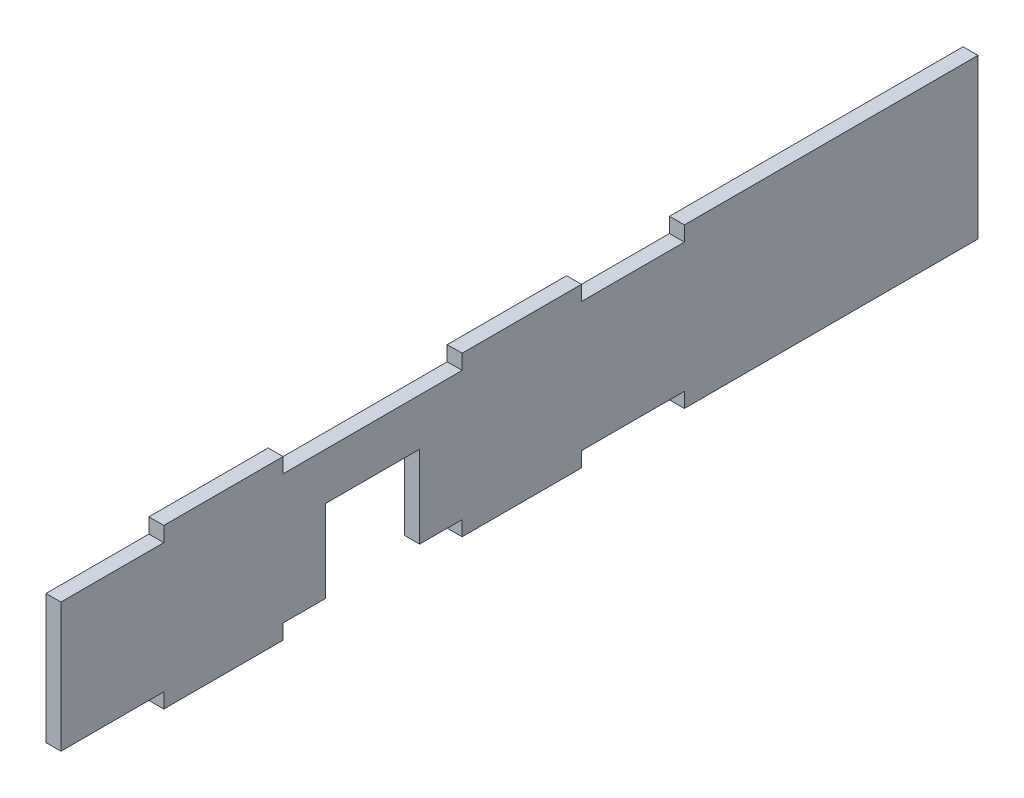
ISO-10303-21;
HEADER;
FILE_DESCRIPTION(('STEP AP214'),'2;1');
FILE_NAME('part.step','',(''),(''),'','','');
FILE_SCHEMA(('AUTOMOTIVE_DESIGN { 1 0 10303 214 1 1 1 1 }'));
ENDSEC;
DATA;
#1=APPLICATION_CONTEXT('core data for automotive mechanical design processes');
#2=APPLICATION_PROTOCOL_DEFINITION('international standard','automotive_design',2000,#1);
#3=PRODUCT_CONTEXT('',#1,'mechanical');
#4=PRODUCT('Part','Part','',(#3));
#5=PRODUCT_RELATED_PRODUCT_CATEGORY('part','',(#4));
#6=PRODUCT_DEFINITION_FORMATION('','',#4);
#7=PRODUCT_DEFINITION_CONTEXT('part definition',#1,'design');
#8=PRODUCT_DEFINITION('design','',#6,#7);
#9=PRODUCT_DEFINITION_SHAPE('','',#8);
#10=(LENGTH_UNIT() NAMED_UNIT(*) SI_UNIT(.MILLI.,.METRE.));
#11=(NAMED_UNIT(*) PLANE_ANGLE_UNIT() SI_UNIT($,.RADIAN.));
#12=(NAMED_UNIT(*) SI_UNIT($,.STERADIAN.) SOLID_ANGLE_UNIT());
#13=UNCERTAINTY_MEASURE_WITH_UNIT(LENGTH_MEASURE(1.E-05),#10,'distance_accuracy_value','');
#14=(GEOMETRIC_REPRESENTATION_CONTEXT(3) GLOBAL_UNCERTAINTY_ASSIGNED_CONTEXT((#13)) GLOBAL_UNIT_ASSIGNED_CONTEXT((#10,
#11,#12)) REPRESENTATION_CONTEXT('',''));
#15=CARTESIAN_POINT('',(0.,0.,0.));
#16=DIRECTION('',(0.,0.,1.));
#17=DIRECTION('',(1.,0.,0.));
#18=AXIS2_PLACEMENT_3D('',#15,#16,#17);
#19=CARTESIAN_POINT('',(6.35,0.,-20.));
#20=DIRECTION('',(0.,0.,1.));
#21=DIRECTION('',(1.,0.,0.));
#22=AXIS2_PLACEMENT_3D('',#19,#20,#21);
#23=PLANE('',#22);
#24=DIRECTION('',(0.,1.,0.));
#25=VECTOR('',#24,1.);
#26=CARTESIAN_POINT('',(0.,0.,-20.));
#27=LINE('',#26,#25);
#28=CARTESIAN_POINT('',(0.,0.,-20.));
#29=VERTEX_POINT('',#28);
#30=CARTESIAN_POINT('',(0.,35.,-20.));
#31=VERTEX_POINT('',#30);
#32=EDGE_CURVE('E467',#29,#31,#27,.T.);
#33=ORIENTED_EDGE('',*,*,#32,.F.);
#34=DIRECTION('',(1.,0.,0.));
#35=VECTOR('',#34,1.);
#36=CARTESIAN_POINT('',(0.,0.,-20.));
#37=LINE('',#36,#35);
#38=CARTESIAN_POINT('',(6.35,0.,-20.));
#39=VERTEX_POINT('',#38);
#40=EDGE_CURVE('E230',#29,#39,#37,.T.);
#41=ORIENTED_EDGE('',*,*,#40,.T.);
#42=DIRECTION('',(0.,1.,0.));
#43=VECTOR('',#42,1.);
#44=CARTESIAN_POINT('',(6.35,0.,-20.));
#45=LINE('',#44,#43);
#46=CARTESIAN_POINT('',(6.35,35.,-20.));
#47=VERTEX_POINT('',#46);
#48=EDGE_CURVE('E468',#39,#47,#45,.T.);
#49=ORIENTED_EDGE('',*,*,#48,.T.);
#50=DIRECTION('',(-1.,0.,0.));
#51=VECTOR('',#50,1.);
#52=CARTESIAN_POINT('',(6.35,35.,-20.));
#53=LINE('',#52,#51);
#54=EDGE_CURVE('E48',#47,#31,#53,.T.);
#55=ORIENTED_EDGE('',*,*,#54,.T.);
#56=EDGE_LOOP('',(#33,#41,#49,#55));
#57=FACE_BOUND('',#56,.T.);
#58=ADVANCED_FACE('F40',(#57),#23,.T.);
#59=CARTESIAN_POINT('',(6.35,0.,132.7));
#60=DIRECTION('',(0.,0.,1.));
#61=DIRECTION('',(1.,0.,0.));
#62=AXIS2_PLACEMENT_3D('',#59,#60,#61);
#63=PLANE('',#62);
#64=DIRECTION('',(0.,1.,0.));
#65=VECTOR('',#64,1.);
#66=CARTESIAN_POINT('',(0.,0.,132.7));
#67=LINE('',#66,#65);
#68=CARTESIAN_POINT('',(0.,0.,132.7));
#69=VERTEX_POINT('',#68);
#70=CARTESIAN_POINT('',(0.,55.000000012,132.7));
#71=VERTEX_POINT('',#70);
#72=EDGE_CURVE('E492',#69,#71,#67,.T.);
#73=ORIENTED_EDGE('',*,*,#72,.F.);
#74=DIRECTION('',(1.,0.,0.));
#75=VECTOR('',#74,1.);
#76=CARTESIAN_POINT('',(0.,0.,132.7));
#77=LINE('',#76,#75);
#78=CARTESIAN_POINT('',(6.35,0.,132.7));
#79=VERTEX_POINT('',#78);
#80=EDGE_CURVE('E306',#69,#79,#77,.T.);
#81=ORIENTED_EDGE('',*,*,#80,.T.);
#82=DIRECTION('',(0.,1.,0.));
#83=VECTOR('',#82,1.);
#84=CARTESIAN_POINT('',(6.35,0.,132.7));
#85=LINE('',#84,#83);
#86=CARTESIAN_POINT('',(6.35,55.000000012,132.7));
#87=VERTEX_POINT('',#86);
#88=EDGE_CURVE('E476',#79,#87,#85,.T.);
#89=ORIENTED_EDGE('',*,*,#88,.T.);
#90=DIRECTION('',(1.,0.,0.));
#91=VECTOR('',#90,1.);
#92=CARTESIAN_POINT('',(0.,55.000000012,132.7));
#93=LINE('',#92,#91);
#94=EDGE_CURVE('E423',#71,#87,#93,.T.);
#95=ORIENTED_EDGE('',*,*,#94,.F.);
#96=EDGE_LOOP('',(#73,#81,#89,#95));
#97=FACE_BOUND('',#96,.T.);
#98=ADVANCED_FACE('F542',(#97),#63,.T.);
#99=CARTESIAN_POINT('',(6.35,0.,20.));
#100=DIRECTION('',(0.,0.,1.));
#101=DIRECTION('',(1.,0.,0.));
#102=AXIS2_PLACEMENT_3D('',#99,#100,#101);
#103=PLANE('',#102);
#104=DIRECTION('',(1.,0.,0.));
#105=VECTOR('',#104,1.);
#106=CARTESIAN_POINT('',(0.,0.,20.));
#107=LINE('',#106,#105);
#108=CARTESIAN_POINT('',(0.,0.,20.));
#109=VERTEX_POINT('',#108);
#110=CARTESIAN_POINT('',(6.35,0.,20.));
#111=VERTEX_POINT('',#110);
#112=EDGE_CURVE('E254',#109,#111,#107,.T.);
#113=ORIENTED_EDGE('',*,*,#112,.F.);
#114=DIRECTION('',(0.,1.,0.));
#115=VECTOR('',#114,1.);
#116=CARTESIAN_POINT('',(0.,0.,20.));
#117=LINE('',#116,#115);
#118=CARTESIAN_POINT('',(0.,35.,20.));
#119=VERTEX_POINT('',#118);
#120=EDGE_CURVE('E496',#109,#119,#117,.T.);
#121=ORIENTED_EDGE('',*,*,#120,.T.);
#122=DIRECTION('',(-1.,0.,0.));
#123=VECTOR('',#122,1.);
#124=CARTESIAN_POINT('',(6.35,35.,20.));
#125=LINE('',#124,#123);
#126=CARTESIAN_POINT('',(6.35,35.,20.));
#127=VERTEX_POINT('',#126);
#128=EDGE_CURVE('E11',#127,#119,#125,.T.);
#129=ORIENTED_EDGE('',*,*,#128,.F.);
#130=DIRECTION('',(0.,1.,0.));
#131=VECTOR('',#130,1.);
#132=CARTESIAN_POINT('',(6.35,0.,20.));
#133=LINE('',#132,#131);
#134=EDGE_CURVE('E480',#111,#127,#133,.T.);
#135=ORIENTED_EDGE('',*,*,#134,.F.);
#136=EDGE_LOOP('',(#113,#121,#129,#135));
#137=FACE_BOUND('',#136,.T.);
#138=ADVANCED_FACE('F515',(#137),#103,.F.);
#139=CARTESIAN_POINT('',(6.35,0.,0.));
#140=DIRECTION('',(1.,0.,0.));
#141=DIRECTION('',(0.,0.,-1.));
#142=AXIS2_PLACEMENT_3D('',#139,#140,#141);
#143=PLANE('',#142);
#144=DIRECTION('',(0.,0.,-1.));
#145=VECTOR('',#144,1.);
#146=CARTESIAN_POINT('',(6.35,0.,0.));
#147=LINE('',#146,#145);
#148=CARTESIAN_POINT('',(6.35,0.,-88.9));
#149=VERTEX_POINT('',#148);
#150=CARTESIAN_POINT('',(6.35,0.,-132.7));
#151=VERTEX_POINT('',#150);
#152=EDGE_CURVE('E389',#149,#151,#147,.T.);
#153=ORIENTED_EDGE('',*,*,#152,.T.);
#154=DIRECTION('',(0.,-1.,0.));
#155=VECTOR('',#154,1.);
#156=CARTESIAN_POINT('',(6.35,0.,-132.7));
#157=LINE('',#156,#155);
#158=CARTESIAN_POINT('',(6.35,-6.35,-132.7));
#159=VERTEX_POINT('',#158);
#160=EDGE_CURVE('E382',#151,#159,#157,.T.);
#161=ORIENTED_EDGE('',*,*,#160,.T.);
#162=DIRECTION('',(0.,0.,1.));
#163=VECTOR('',#162,1.);
#164=CARTESIAN_POINT('',(6.35,-6.35,-257.700000096));
#165=LINE('',#164,#163);
#166=CARTESIAN_POINT('',(6.35,-6.35,-257.700000096));
#167=VERTEX_POINT('',#166);
#168=EDGE_CURVE('E463',#167,#159,#165,.T.);
#169=ORIENTED_EDGE('',*,*,#168,.F.);
#170=DIRECTION('',(0.,1.,0.));
#171=VECTOR('',#170,1.);
#172=CARTESIAN_POINT('',(6.35,0.,-257.700000096));
#173=LINE('',#172,#171);
#174=CARTESIAN_POINT('',(6.35,61.350000012,-257.700000096));
#175=VERTEX_POINT('',#174);
#176=EDGE_CURVE('E471',#167,#175,#173,.T.);
#177=ORIENTED_EDGE('',*,*,#176,.T.);
#178=DIRECTION('',(0.,0.,-1.));
#179=VECTOR('',#178,1.);
#180=CARTESIAN_POINT('',(6.35,61.350000012,132.7));
#181=LINE('',#180,#179);
#182=CARTESIAN_POINT('',(6.35,61.350000012,-132.7));
#183=VERTEX_POINT('',#182);
#184=EDGE_CURVE('E441',#183,#175,#181,.T.);
#185=ORIENTED_EDGE('',*,*,#184,.F.);
#186=DIRECTION('',(0.,1.,0.));
#187=VECTOR('',#186,1.);
#188=CARTESIAN_POINT('',(6.35,0.,-132.7));
#189=LINE('',#188,#187);
#190=CARTESIAN_POINT('',(6.35,55.000000012,-132.7));
#191=VERTEX_POINT('',#190);
#192=EDGE_CURVE('E348',#191,#183,#189,.T.);
#193=ORIENTED_EDGE('',*,*,#192,.F.);
#194=DIRECTION('',(0.,0.,1.));
#195=VECTOR('',#194,1.);
#196=CARTESIAN_POINT('',(6.35,55.000000012,0.));
#197=LINE('',#196,#195);
#198=CARTESIAN_POINT('',(6.35,55.000000012,-88.9));
#199=VERTEX_POINT('',#198);
#200=EDGE_CURVE('E360',#191,#199,#197,.T.);
#201=ORIENTED_EDGE('',*,*,#200,.T.);
#202=DIRECTION('',(0.,1.,0.));
#203=VECTOR('',#202,1.);
#204=CARTESIAN_POINT('',(6.35,0.,-88.9));
#205=LINE('',#204,#203);
#206=CARTESIAN_POINT('',(6.35,61.350000012,-88.9));
#207=VERTEX_POINT('',#206);
#208=EDGE_CURVE('E356',#199,#207,#205,.T.);
#209=ORIENTED_EDGE('',*,*,#208,.T.);
#210=CARTESIAN_POINT('',(6.35,61.350000012,-38.1));
#211=VERTEX_POINT('',#210);
#212=EDGE_CURVE('E445',#211,#207,#181,.T.);
#213=ORIENTED_EDGE('',*,*,#212,.F.);
#214=DIRECTION('',(0.,1.,0.));
#215=VECTOR('',#214,1.);
#216=CARTESIAN_POINT('',(6.35,0.,-38.1));
#217=LINE('',#216,#215);
#218=CARTESIAN_POINT('',(6.35,55.000000012,-38.1));
#219=VERTEX_POINT('',#218);
#220=EDGE_CURVE('E316',#219,#211,#217,.T.);
#221=ORIENTED_EDGE('',*,*,#220,.F.);
#222=DIRECTION('',(0.,0.,1.));
#223=VECTOR('',#222,1.);
#224=CARTESIAN_POINT('',(6.35,55.000000012,0.));
#225=LINE('',#224,#223);
#226=CARTESIAN_POINT('',(6.35,55.000000012,38.1));
#227=VERTEX_POINT('',#226);
#228=EDGE_CURVE('E327',#219,#227,#225,.T.);
#229=ORIENTED_EDGE('',*,*,#228,.T.);
#230=DIRECTION('',(0.,1.,0.));
#231=VECTOR('',#230,1.);
#232=CARTESIAN_POINT('',(6.35,0.,38.1));
#233=LINE('',#232,#231);
#234=CARTESIAN_POINT('',(6.35,61.350000012,38.1));
#235=VERTEX_POINT('',#234);
#236=EDGE_CURVE('E259',#227,#235,#233,.T.);
#237=ORIENTED_EDGE('',*,*,#236,.T.);
#238=CARTESIAN_POINT('',(6.35,61.350000012,88.9));
#239=VERTEX_POINT('',#238);
#240=EDGE_CURVE('E446',#239,#235,#181,.T.);
#241=ORIENTED_EDGE('',*,*,#240,.F.);
#242=DIRECTION('',(0.,1.,0.));
#243=VECTOR('',#242,1.);
#244=CARTESIAN_POINT('',(6.35,0.,88.9));
#245=LINE('',#244,#243);
#246=CARTESIAN_POINT('',(6.35,55.000000012,88.9));
#247=VERTEX_POINT('',#246);
#248=EDGE_CURVE('E413',#247,#239,#245,.T.);
#249=ORIENTED_EDGE('',*,*,#248,.F.);
#250=DIRECTION('',(0.,0.,1.));
#251=VECTOR('',#250,1.);
#252=CARTESIAN_POINT('',(6.35,55.000000012,0.));
#253=LINE('',#252,#251);
#254=EDGE_CURVE('E305',#247,#87,#253,.T.);
#255=ORIENTED_EDGE('',*,*,#254,.T.);
#256=ORIENTED_EDGE('',*,*,#88,.F.);
#257=DIRECTION('',(0.,0.,-1.));
#258=VECTOR('',#257,1.);
#259=CARTESIAN_POINT('',(6.35,0.,0.));
#260=LINE('',#259,#258);
#261=CARTESIAN_POINT('',(6.35,0.,88.9));
#262=VERTEX_POINT('',#261);
#263=EDGE_CURVE('E290',#79,#262,#260,.T.);
#264=ORIENTED_EDGE('',*,*,#263,.T.);
#265=DIRECTION('',(0.,-1.,0.));
#266=VECTOR('',#265,1.);
#267=CARTESIAN_POINT('',(6.35,0.,88.9));
#268=LINE('',#267,#266);
#269=CARTESIAN_POINT('',(6.35,-6.35,88.9));
#270=VERTEX_POINT('',#269);
#271=EDGE_CURVE('E294',#262,#270,#268,.T.);
#272=ORIENTED_EDGE('',*,*,#271,.T.);
#273=DIRECTION('',(0.,0.,1.));
#274=VECTOR('',#273,1.);
#275=CARTESIAN_POINT('',(6.35,-6.35,20.));
#276=LINE('',#275,#274);
#277=CARTESIAN_POINT('',(6.35,-6.35,38.1));
#278=VERTEX_POINT('',#277);
#279=EDGE_CURVE('E451',#278,#270,#276,.T.);
#280=ORIENTED_EDGE('',*,*,#279,.F.);
#281=DIRECTION('',(0.,-1.,0.));
#282=VECTOR('',#281,1.);
#283=CARTESIAN_POINT('',(6.35,0.,38.1));
#284=LINE('',#283,#282);
#285=CARTESIAN_POINT('',(6.35,0.,38.1));
#286=VERTEX_POINT('',#285);
#287=EDGE_CURVE('E266',#286,#278,#284,.T.);
#288=ORIENTED_EDGE('',*,*,#287,.F.);
#289=DIRECTION('',(0.,0.,-1.));
#290=VECTOR('',#289,1.);
#291=CARTESIAN_POINT('',(6.35,0.,0.));
#292=LINE('',#291,#290);
#293=EDGE_CURVE('E271',#286,#111,#292,.T.);
#294=ORIENTED_EDGE('',*,*,#293,.T.);
#295=ORIENTED_EDGE('',*,*,#134,.T.);
#296=DIRECTION('',(0.,0.,-1.));
#297=VECTOR('',#296,1.);
#298=CARTESIAN_POINT('',(6.35,35.,0.));
#299=LINE('',#298,#297);
#300=EDGE_CURVE('E483',#127,#47,#299,.T.);
#301=ORIENTED_EDGE('',*,*,#300,.T.);
#302=ORIENTED_EDGE('',*,*,#48,.F.);
#303=DIRECTION('',(0.,0.,-1.));
#304=VECTOR('',#303,1.);
#305=CARTESIAN_POINT('',(6.35,0.,0.));
#306=LINE('',#305,#304);
#307=CARTESIAN_POINT('',(6.35,0.,-38.1));
#308=VERTEX_POINT('',#307);
#309=EDGE_CURVE('E248',#39,#308,#306,.T.);
#310=ORIENTED_EDGE('',*,*,#309,.T.);
#311=DIRECTION('',(0.,-1.,0.));
#312=VECTOR('',#311,1.);
#313=CARTESIAN_POINT('',(6.35,0.,-38.1));
#314=LINE('',#313,#312);
#315=CARTESIAN_POINT('',(6.35,-6.35,-38.1));
#316=VERTEX_POINT('',#315);
#317=EDGE_CURVE('E237',#308,#316,#314,.T.);
#318=ORIENTED_EDGE('',*,*,#317,.T.);
#319=CARTESIAN_POINT('',(6.35,-6.35,-88.9000000000001));
#320=VERTEX_POINT('',#319);
#321=EDGE_CURVE('E462',#320,#316,#165,.T.);
#322=ORIENTED_EDGE('',*,*,#321,.F.);
#323=DIRECTION('',(0.,-1.,0.));
#324=VECTOR('',#323,1.);
#325=CARTESIAN_POINT('',(6.35,0.,-88.9));
#326=LINE('',#325,#324);
#327=EDGE_CURVE('E55',#149,#320,#326,.T.);
#328=ORIENTED_EDGE('',*,*,#327,.F.);
#329=EDGE_LOOP('',(#153,#161,#169,#177,#185,#193,#201,#209,#213,#221,#229,#237,#241,#249,#255,
#256,#264,#272,#280,#288,#294,#295,#301,#302,#310,#318,#322,#328));
#330=FACE_BOUND('',#329,.T.);
#331=ADVANCED_FACE('F522',(#330),#143,.T.);
#332=CARTESIAN_POINT('',(0.,0.,0.));
#333=DIRECTION('',(1.,0.,0.));
#334=DIRECTION('',(0.,0.,-1.));
#335=AXIS2_PLACEMENT_3D('',#332,#333,#334);
#336=PLANE('',#335);
#337=DIRECTION('',(0.,-1.,0.));
#338=VECTOR('',#337,1.);
#339=CARTESIAN_POINT('',(0.,0.,-132.7));
#340=LINE('',#339,#338);
#341=CARTESIAN_POINT('',(0.,0.,-132.7));
#342=VERTEX_POINT('',#341);
#343=CARTESIAN_POINT('',(0.,-6.35,-132.7));
#344=VERTEX_POINT('',#343);
#345=EDGE_CURVE('E385',#342,#344,#340,.T.);
#346=ORIENTED_EDGE('',*,*,#345,.F.);
#347=DIRECTION('',(0.,0.,-1.));
#348=VECTOR('',#347,1.);
#349=CARTESIAN_POINT('',(0.,0.,0.));
#350=LINE('',#349,#348);
#351=CARTESIAN_POINT('',(0.,0.,-88.9));
#352=VERTEX_POINT('',#351);
#353=EDGE_CURVE('E378',#352,#342,#350,.T.);
#354=ORIENTED_EDGE('',*,*,#353,.F.);
#355=DIRECTION('',(0.,-1.,0.));
#356=VECTOR('',#355,1.);
#357=CARTESIAN_POINT('',(0.,0.,-88.9));
#358=LINE('',#357,#356);
#359=CARTESIAN_POINT('',(0.,-6.35,-88.9));
#360=VERTEX_POINT('',#359);
#361=EDGE_CURVE('E381',#352,#360,#358,.T.);
#362=ORIENTED_EDGE('',*,*,#361,.T.);
#363=DIRECTION('',(0.,0.,-1.));
#364=VECTOR('',#363,1.);
#365=CARTESIAN_POINT('',(0.,-6.35,-20.));
#366=LINE('',#365,#364);
#367=CARTESIAN_POINT('',(0.,-6.35,-38.1));
#368=VERTEX_POINT('',#367);
#369=EDGE_CURVE('E246',#368,#360,#366,.T.);
#370=ORIENTED_EDGE('',*,*,#369,.F.);
#371=DIRECTION('',(0.,-1.,0.));
#372=VECTOR('',#371,1.);
#373=CARTESIAN_POINT('',(0.,0.,-38.1));
#374=LINE('',#373,#372);
#375=CARTESIAN_POINT('',(0.,0.,-38.1));
#376=VERTEX_POINT('',#375);
#377=EDGE_CURVE('E63',#376,#368,#374,.T.);
#378=ORIENTED_EDGE('',*,*,#377,.F.);
#379=DIRECTION('',(0.,0.,-1.));
#380=VECTOR('',#379,1.);
#381=CARTESIAN_POINT('',(0.,0.,0.));
#382=LINE('',#381,#380);
#383=EDGE_CURVE('E225',#29,#376,#382,.T.);
#384=ORIENTED_EDGE('',*,*,#383,.F.);
#385=ORIENTED_EDGE('',*,*,#32,.T.);
#386=DIRECTION('',(0.,0.,-1.));
#387=VECTOR('',#386,1.);
#388=CARTESIAN_POINT('',(0.,35.,0.));
#389=LINE('',#388,#387);
#390=EDGE_CURVE('E472',#119,#31,#389,.T.);
#391=ORIENTED_EDGE('',*,*,#390,.F.);
#392=ORIENTED_EDGE('',*,*,#120,.F.);
#393=DIRECTION('',(0.,0.,-1.));
#394=VECTOR('',#393,1.);
#395=CARTESIAN_POINT('',(0.,0.,0.));
#396=LINE('',#395,#394);
#397=CARTESIAN_POINT('',(0.,0.,38.1));
#398=VERTEX_POINT('',#397);
#399=EDGE_CURVE('E262',#398,#109,#396,.T.);
#400=ORIENTED_EDGE('',*,*,#399,.F.);
#401=DIRECTION('',(0.,-1.,0.));
#402=VECTOR('',#401,1.);
#403=CARTESIAN_POINT('',(0.,0.,38.1));
#404=LINE('',#403,#402);
#405=CARTESIAN_POINT('',(0.,-6.35,38.1));
#406=VERTEX_POINT('',#405);
#407=EDGE_CURVE('E265',#398,#406,#404,.T.);
#408=ORIENTED_EDGE('',*,*,#407,.T.);
#409=DIRECTION('',(0.,0.,-1.));
#410=VECTOR('',#409,1.);
#411=CARTESIAN_POINT('',(0.,-6.35,132.7));
#412=LINE('',#411,#410);
#413=CARTESIAN_POINT('',(0.,-6.35,88.9));
#414=VERTEX_POINT('',#413);
#415=EDGE_CURVE('E447',#414,#406,#412,.T.);
#416=ORIENTED_EDGE('',*,*,#415,.F.);
#417=DIRECTION('',(0.,-1.,0.));
#418=VECTOR('',#417,1.);
#419=CARTESIAN_POINT('',(0.,0.,88.9));
#420=LINE('',#419,#418);
#421=CARTESIAN_POINT('',(0.,0.,88.9));
#422=VERTEX_POINT('',#421);
#423=EDGE_CURVE('E286',#422,#414,#420,.T.);
#424=ORIENTED_EDGE('',*,*,#423,.F.);
#425=DIRECTION('',(0.,0.,-1.));
#426=VECTOR('',#425,1.);
#427=CARTESIAN_POINT('',(0.,0.,0.));
#428=LINE('',#427,#426);
#429=EDGE_CURVE('E289',#69,#422,#428,.T.);
#430=ORIENTED_EDGE('',*,*,#429,.F.);
#431=ORIENTED_EDGE('',*,*,#72,.T.);
#432=DIRECTION('',(0.,0.,1.));
#433=VECTOR('',#432,1.);
#434=CARTESIAN_POINT('',(0.,55.000000012,0.));
#435=LINE('',#434,#433);
#436=CARTESIAN_POINT('',(0.,55.000000012,88.9));
#437=VERTEX_POINT('',#436);
#438=EDGE_CURVE('E409',#437,#71,#435,.T.);
#439=ORIENTED_EDGE('',*,*,#438,.F.);
#440=DIRECTION('',(0.,1.,0.));
#441=VECTOR('',#440,1.);
#442=CARTESIAN_POINT('',(0.,0.,88.9));
#443=LINE('',#442,#441);
#444=CARTESIAN_POINT('',(0.,61.350000012,88.9));
#445=VERTEX_POINT('',#444);
#446=EDGE_CURVE('E412',#437,#445,#443,.T.);
#447=ORIENTED_EDGE('',*,*,#446,.T.);
#448=DIRECTION('',(0.,0.,1.));
#449=VECTOR('',#448,1.);
#450=CARTESIAN_POINT('',(0.,61.350000012,-257.700000096));
#451=LINE('',#450,#449);
#452=CARTESIAN_POINT('',(0.,61.350000012,38.1));
#453=VERTEX_POINT('',#452);
#454=EDGE_CURVE('E436',#453,#445,#451,.T.);
#455=ORIENTED_EDGE('',*,*,#454,.F.);
#456=DIRECTION('',(0.,1.,0.));
#457=VECTOR('',#456,1.);
#458=CARTESIAN_POINT('',(0.,0.,38.1));
#459=LINE('',#458,#457);
#460=CARTESIAN_POINT('',(0.,55.000000012,38.1));
#461=VERTEX_POINT('',#460);
#462=EDGE_CURVE('E312',#461,#453,#459,.T.);
#463=ORIENTED_EDGE('',*,*,#462,.F.);
#464=DIRECTION('',(0.,0.,1.));
#465=VECTOR('',#464,1.);
#466=CARTESIAN_POINT('',(0.,55.000000012,0.));
#467=LINE('',#466,#465);
#468=CARTESIAN_POINT('',(0.,55.000000012,-38.1));
#469=VERTEX_POINT('',#468);
#470=EDGE_CURVE('E315',#469,#461,#467,.T.);
#471=ORIENTED_EDGE('',*,*,#470,.F.);
#472=DIRECTION('',(0.,1.,0.));
#473=VECTOR('',#472,1.);
#474=CARTESIAN_POINT('',(0.,0.,-38.1));
#475=LINE('',#474,#473);
#476=CARTESIAN_POINT('',(0.,61.350000012,-38.1));
#477=VERTEX_POINT('',#476);
#478=EDGE_CURVE('E319',#469,#477,#475,.T.);
#479=ORIENTED_EDGE('',*,*,#478,.T.);
#480=CARTESIAN_POINT('',(0.,61.350000012,-88.9));
#481=VERTEX_POINT('',#480);
#482=EDGE_CURVE('E442',#481,#477,#451,.T.);
#483=ORIENTED_EDGE('',*,*,#482,.F.);
#484=DIRECTION('',(0.,1.,0.));
#485=VECTOR('',#484,1.);
#486=CARTESIAN_POINT('',(0.,0.,-88.9));
#487=LINE('',#486,#485);
#488=CARTESIAN_POINT('',(0.,55.000000012,-88.9));
#489=VERTEX_POINT('',#488);
#490=EDGE_CURVE('E344',#489,#481,#487,.T.);
#491=ORIENTED_EDGE('',*,*,#490,.F.);
#492=DIRECTION('',(0.,0.,1.));
#493=VECTOR('',#492,1.);
#494=CARTESIAN_POINT('',(0.,55.000000012,0.));
#495=LINE('',#494,#493);
#496=CARTESIAN_POINT('',(0.,55.000000012,-132.7));
#497=VERTEX_POINT('',#496);
#498=EDGE_CURVE('E347',#497,#489,#495,.T.);
#499=ORIENTED_EDGE('',*,*,#498,.F.);
#500=DIRECTION('',(0.,1.,0.));
#501=VECTOR('',#500,1.);
#502=CARTESIAN_POINT('',(0.,0.,-132.7));
#503=LINE('',#502,#501);
#504=CARTESIAN_POINT('',(0.,61.350000012,-132.7));
#505=VERTEX_POINT('',#504);
#506=EDGE_CURVE('E351',#497,#505,#503,.T.);
#507=ORIENTED_EDGE('',*,*,#506,.T.);
#508=CARTESIAN_POINT('',(0.,61.350000012,-257.700000096));
#509=VERTEX_POINT('',#508);
#510=EDGE_CURVE('E437',#509,#505,#451,.T.);
#511=ORIENTED_EDGE('',*,*,#510,.F.);
#512=DIRECTION('',(0.,1.,0.));
#513=VECTOR('',#512,1.);
#514=CARTESIAN_POINT('',(0.,0.,-257.700000096));
#515=LINE('',#514,#513);
#516=CARTESIAN_POINT('',(0.,-6.35,-257.700000096));
#517=VERTEX_POINT('',#516);
#518=EDGE_CURVE('E489',#517,#509,#515,.T.);
#519=ORIENTED_EDGE('',*,*,#518,.F.);
#520=EDGE_CURVE('E455',#344,#517,#366,.T.);
#521=ORIENTED_EDGE('',*,*,#520,.F.);
#522=EDGE_LOOP('',(#346,#354,#362,#370,#378,#384,#385,#391,#392,#400,#408,#416,#424,#430,#431,
#439,#447,#455,#463,#471,#479,#483,#491,#499,#507,#511,#519,#521));
#523=FACE_BOUND('',#522,.T.);
#524=ADVANCED_FACE('F243',(#523),#336,.F.);
#525=CARTESIAN_POINT('',(0.,-6.35,0.));
#526=DIRECTION('',(0.,-1.,0.));
#527=DIRECTION('',(0.,0.,-1.));
#528=AXIS2_PLACEMENT_3D('',#525,#526,#527);
#529=PLANE('',#528);
#530=ORIENTED_EDGE('',*,*,#168,.T.);
#531=DIRECTION('',(1.,0.,0.));
#532=VECTOR('',#531,1.);
#533=CARTESIAN_POINT('',(0.,-6.35,-132.7));
#534=LINE('',#533,#532);
#535=EDGE_CURVE('E401',#344,#159,#534,.T.);
#536=ORIENTED_EDGE('',*,*,#535,.F.);
#537=ORIENTED_EDGE('',*,*,#520,.T.);
#538=DIRECTION('',(1.,0.,0.));
#539=VECTOR('',#538,1.);
#540=CARTESIAN_POINT('',(0.,-6.35,-257.700000096));
#541=LINE('',#540,#539);
#542=EDGE_CURVE('E458',#517,#167,#541,.T.);
#543=ORIENTED_EDGE('',*,*,#542,.T.);
#544=EDGE_LOOP('',(#530,#536,#537,#543));
#545=FACE_BOUND('',#544,.T.);
#546=ADVANCED_FACE('F627',(#545),#529,.T.);
#547=DIRECTION('',(1.,0.,0.));
#548=VECTOR('',#547,1.);
#549=CARTESIAN_POINT('',(0.,-6.35,-88.9));
#550=LINE('',#549,#548);
#551=EDGE_CURVE('E404',#360,#320,#550,.T.);
#552=ORIENTED_EDGE('',*,*,#551,.T.);
#553=ORIENTED_EDGE('',*,*,#321,.T.);
#554=DIRECTION('',(1.,0.,0.));
#555=VECTOR('',#554,1.);
#556=CARTESIAN_POINT('',(0.,-6.35,-38.1));
#557=LINE('',#556,#555);
#558=EDGE_CURVE('E256',#368,#316,#557,.T.);
#559=ORIENTED_EDGE('',*,*,#558,.F.);
#560=ORIENTED_EDGE('',*,*,#369,.T.);
#561=EDGE_LOOP('',(#552,#553,#559,#560));
#562=FACE_BOUND('',#561,.T.);
#563=ADVANCED_FACE('F641',(#562),#529,.T.);
#564=CARTESIAN_POINT('',(0.,-6.35,0.));
#565=DIRECTION('',(0.,-1.,0.));
#566=DIRECTION('',(0.,0.,-1.));
#567=AXIS2_PLACEMENT_3D('',#564,#565,#566);
#568=PLANE('',#567);
#569=ORIENTED_EDGE('',*,*,#279,.T.);
#570=DIRECTION('',(1.,0.,0.));
#571=VECTOR('',#570,1.);
#572=CARTESIAN_POINT('',(0.,-6.35,88.9));
#573=LINE('',#572,#571);
#574=EDGE_CURVE('E302',#414,#270,#573,.T.);
#575=ORIENTED_EDGE('',*,*,#574,.F.);
#576=ORIENTED_EDGE('',*,*,#415,.T.);
#577=DIRECTION('',(1.,0.,0.));
#578=VECTOR('',#577,1.);
#579=CARTESIAN_POINT('',(0.,-6.35,38.1));
#580=LINE('',#579,#578);
#581=EDGE_CURVE('E280',#406,#278,#580,.T.);
#582=ORIENTED_EDGE('',*,*,#581,.T.);
#583=EDGE_LOOP('',(#569,#575,#576,#582));
#584=FACE_BOUND('',#583,.T.);
#585=ADVANCED_FACE('F528',(#584),#568,.T.);
#586=CARTESIAN_POINT('',(0.,61.350000012,0.));
#587=DIRECTION('',(0.,1.,0.));
#588=DIRECTION('',(0.,0.,1.));
#589=AXIS2_PLACEMENT_3D('',#586,#587,#588);
#590=PLANE('',#589);
#591=ORIENTED_EDGE('',*,*,#212,.T.);
#592=DIRECTION('',(1.,0.,0.));
#593=VECTOR('',#592,1.);
#594=CARTESIAN_POINT('',(0.,61.350000012,-88.9));
#595=LINE('',#594,#593);
#596=EDGE_CURVE('E275',#481,#207,#595,.T.);
#597=ORIENTED_EDGE('',*,*,#596,.F.);
#598=ORIENTED_EDGE('',*,*,#482,.T.);
#599=DIRECTION('',(1.,0.,0.));
#600=VECTOR('',#599,1.);
#601=CARTESIAN_POINT('',(0.,61.350000012,-38.1));
#602=LINE('',#601,#600);
#603=EDGE_CURVE('E335',#477,#211,#602,.T.);
#604=ORIENTED_EDGE('',*,*,#603,.T.);
#605=EDGE_LOOP('',(#591,#597,#598,#604));
#606=FACE_BOUND('',#605,.T.);
#607=ADVANCED_FACE('F566',(#606),#590,.T.);
#608=ORIENTED_EDGE('',*,*,#240,.T.);
#609=DIRECTION('',(1.,0.,0.));
#610=VECTOR('',#609,1.);
#611=CARTESIAN_POINT('',(0.,61.350000012,38.1));
#612=LINE('',#611,#610);
#613=EDGE_CURVE('E298',#453,#235,#612,.T.);
#614=ORIENTED_EDGE('',*,*,#613,.F.);
#615=ORIENTED_EDGE('',*,*,#454,.T.);
#616=DIRECTION('',(1.,0.,0.));
#617=VECTOR('',#616,1.);
#618=CARTESIAN_POINT('',(0.,61.350000012,88.9));
#619=LINE('',#618,#617);
#620=EDGE_CURVE('E427',#445,#239,#619,.T.);
#621=ORIENTED_EDGE('',*,*,#620,.T.);
#622=EDGE_LOOP('',(#608,#614,#615,#621));
#623=FACE_BOUND('',#622,.T.);
#624=ADVANCED_FACE('F558',(#623),#590,.T.);
#625=CARTESIAN_POINT('',(6.35,0.,-257.700000096));
#626=DIRECTION('',(0.,0.,1.));
#627=DIRECTION('',(1.,0.,0.));
#628=AXIS2_PLACEMENT_3D('',#625,#626,#627);
#629=PLANE('',#628);
#630=ORIENTED_EDGE('',*,*,#518,.T.);
#631=DIRECTION('',(-1.,0.,0.));
#632=VECTOR('',#631,1.);
#633=CARTESIAN_POINT('',(6.35,61.350000012,-257.700000096));
#634=LINE('',#633,#632);
#635=EDGE_CURVE('E426',#175,#509,#634,.T.);
#636=ORIENTED_EDGE('',*,*,#635,.F.);
#637=ORIENTED_EDGE('',*,*,#176,.F.);
#638=ORIENTED_EDGE('',*,*,#542,.F.);
#639=EDGE_LOOP('',(#630,#636,#637,#638));
#640=FACE_BOUND('',#639,.T.);
#641=ADVANCED_FACE('F608',(#640),#629,.F.);
#642=CARTESIAN_POINT('',(6.35,35.,0.));
#643=DIRECTION('',(0.,1.,0.));
#644=DIRECTION('',(0.,0.,1.));
#645=AXIS2_PLACEMENT_3D('',#642,#643,#644);
#646=PLANE('',#645);
#647=ORIENTED_EDGE('',*,*,#390,.T.);
#648=ORIENTED_EDGE('',*,*,#54,.F.);
#649=ORIENTED_EDGE('',*,*,#300,.F.);
#650=ORIENTED_EDGE('',*,*,#128,.T.);
#651=EDGE_LOOP('',(#647,#648,#649,#650));
#652=FACE_BOUND('',#651,.T.);
#653=ADVANCED_FACE('F509',(#652),#646,.F.);
#654=DIRECTION('',(1.,0.,0.));
#655=VECTOR('',#654,1.);
#656=CARTESIAN_POINT('',(0.,61.350000012,-132.7));
#657=LINE('',#656,#655);
#658=EDGE_CURVE('E369',#505,#183,#657,.T.);
#659=ORIENTED_EDGE('',*,*,#658,.T.);
#660=ORIENTED_EDGE('',*,*,#184,.T.);
#661=ORIENTED_EDGE('',*,*,#635,.T.);
#662=ORIENTED_EDGE('',*,*,#510,.T.);
#663=EDGE_LOOP('',(#659,#660,#661,#662));
#664=FACE_BOUND('',#663,.T.);
#665=ADVANCED_FACE('F613',(#664),#590,.T.);
#666=CARTESIAN_POINT('',(0.,55.000000012,0.));
#667=DIRECTION('',(0.,1.,0.));
#668=DIRECTION('',(0.,0.,1.));
#669=AXIS2_PLACEMENT_3D('',#666,#667,#668);
#670=PLANE('',#669);
#671=ORIENTED_EDGE('',*,*,#254,.F.);
#672=DIRECTION('',(1.,0.,0.));
#673=VECTOR('',#672,1.);
#674=CARTESIAN_POINT('',(0.,55.000000012,88.9));
#675=LINE('',#674,#673);
#676=EDGE_CURVE('E417',#437,#247,#675,.T.);
#677=ORIENTED_EDGE('',*,*,#676,.F.);
#678=ORIENTED_EDGE('',*,*,#438,.T.);
#679=ORIENTED_EDGE('',*,*,#94,.T.);
#680=EDGE_LOOP('',(#671,#677,#678,#679));
#681=FACE_BOUND('',#680,.T.);
#682=ADVANCED_FACE('F548',(#681),#670,.T.);
#683=CARTESIAN_POINT('',(0.,0.,88.9));
#684=DIRECTION('',(0.,0.,-1.));
#685=DIRECTION('',(-1.,0.,0.));
#686=AXIS2_PLACEMENT_3D('',#683,#684,#685);
#687=PLANE('',#686);
#688=ORIENTED_EDGE('',*,*,#248,.T.);
#689=ORIENTED_EDGE('',*,*,#620,.F.);
#690=ORIENTED_EDGE('',*,*,#446,.F.);
#691=ORIENTED_EDGE('',*,*,#676,.T.);
#692=EDGE_LOOP('',(#688,#689,#690,#691));
#693=FACE_BOUND('',#692,.T.);
#694=ADVANCED_FACE('F653',(#693),#687,.F.);
#695=CARTESIAN_POINT('',(0.,0.,38.1));
#696=DIRECTION('',(0.,0.,-1.));
#697=DIRECTION('',(-1.,0.,0.));
#698=AXIS2_PLACEMENT_3D('',#695,#696,#697);
#699=PLANE('',#698);
#700=ORIENTED_EDGE('',*,*,#236,.F.);
#701=DIRECTION('',(1.,0.,0.));
#702=VECTOR('',#701,1.);
#703=CARTESIAN_POINT('',(0.,55.000000012,38.1));
#704=LINE('',#703,#702);
#705=EDGE_CURVE('E323',#461,#227,#704,.T.);
#706=ORIENTED_EDGE('',*,*,#705,.F.);
#707=ORIENTED_EDGE('',*,*,#462,.T.);
#708=ORIENTED_EDGE('',*,*,#613,.T.);
#709=EDGE_LOOP('',(#700,#706,#707,#708));
#710=FACE_BOUND('',#709,.T.);
#711=ADVANCED_FACE('F582',(#710),#699,.T.);
#712=CARTESIAN_POINT('',(0.,0.,-38.1));
#713=DIRECTION('',(0.,0.,-1.));
#714=DIRECTION('',(-1.,0.,0.));
#715=AXIS2_PLACEMENT_3D('',#712,#713,#714);
#716=PLANE('',#715);
#717=ORIENTED_EDGE('',*,*,#220,.T.);
#718=ORIENTED_EDGE('',*,*,#603,.F.);
#719=ORIENTED_EDGE('',*,*,#478,.F.);
#720=DIRECTION('',(1.,0.,0.));
#721=VECTOR('',#720,1.);
#722=CARTESIAN_POINT('',(0.,55.000000012,-38.1));
#723=LINE('',#722,#721);
#724=EDGE_CURVE('E339',#469,#219,#723,.T.);
#725=ORIENTED_EDGE('',*,*,#724,.T.);
#726=EDGE_LOOP('',(#717,#718,#719,#725));
#727=FACE_BOUND('',#726,.T.);
#728=ADVANCED_FACE('F573',(#727),#716,.F.);
#729=CARTESIAN_POINT('',(0.,55.000000012,0.));
#730=DIRECTION('',(0.,1.,0.));
#731=DIRECTION('',(0.,0.,1.));
#732=AXIS2_PLACEMENT_3D('',#729,#730,#731);
#733=PLANE('',#732);
#734=ORIENTED_EDGE('',*,*,#228,.F.);
#735=ORIENTED_EDGE('',*,*,#724,.F.);
#736=ORIENTED_EDGE('',*,*,#470,.T.);
#737=ORIENTED_EDGE('',*,*,#705,.T.);
#738=EDGE_LOOP('',(#734,#735,#736,#737));
#739=FACE_BOUND('',#738,.T.);
#740=ADVANCED_FACE('F584',(#739),#733,.T.);
#741=CARTESIAN_POINT('',(0.,0.,-88.9));
#742=DIRECTION('',(0.,0.,-1.));
#743=DIRECTION('',(-1.,0.,0.));
#744=AXIS2_PLACEMENT_3D('',#741,#742,#743);
#745=PLANE('',#744);
#746=ORIENTED_EDGE('',*,*,#208,.F.);
#747=DIRECTION('',(1.,0.,0.));
#748=VECTOR('',#747,1.);
#749=CARTESIAN_POINT('',(0.,55.000000012,-88.9));
#750=LINE('',#749,#748);
#751=EDGE_CURVE('E355',#489,#199,#750,.T.);
#752=ORIENTED_EDGE('',*,*,#751,.F.);
#753=ORIENTED_EDGE('',*,*,#490,.T.);
#754=ORIENTED_EDGE('',*,*,#596,.T.);
#755=EDGE_LOOP('',(#746,#752,#753,#754));
#756=FACE_BOUND('',#755,.T.);
#757=ADVANCED_FACE('F586',(#756),#745,.T.);
#758=CARTESIAN_POINT('',(0.,0.,-132.7));
#759=DIRECTION('',(0.,0.,-1.));
#760=DIRECTION('',(-1.,0.,0.));
#761=AXIS2_PLACEMENT_3D('',#758,#759,#760);
#762=PLANE('',#761);
#763=ORIENTED_EDGE('',*,*,#192,.T.);
#764=ORIENTED_EDGE('',*,*,#658,.F.);
#765=ORIENTED_EDGE('',*,*,#506,.F.);
#766=DIRECTION('',(1.,0.,0.));
#767=VECTOR('',#766,1.);
#768=CARTESIAN_POINT('',(0.,55.000000012,-132.7));
#769=LINE('',#768,#767);
#770=EDGE_CURVE('E373',#497,#191,#769,.T.);
#771=ORIENTED_EDGE('',*,*,#770,.T.);
#772=EDGE_LOOP('',(#763,#764,#765,#771));
#773=FACE_BOUND('',#772,.T.);
#774=ADVANCED_FACE('F592',(#773),#762,.F.);
#775=CARTESIAN_POINT('',(0.,55.000000012,0.));
#776=DIRECTION('',(0.,1.,0.));
#777=DIRECTION('',(0.,0.,1.));
#778=AXIS2_PLACEMENT_3D('',#775,#776,#777);
#779=PLANE('',#778);
#780=ORIENTED_EDGE('',*,*,#200,.F.);
#781=ORIENTED_EDGE('',*,*,#770,.F.);
#782=ORIENTED_EDGE('',*,*,#498,.T.);
#783=ORIENTED_EDGE('',*,*,#751,.T.);
#784=EDGE_LOOP('',(#780,#781,#782,#783));
#785=FACE_BOUND('',#784,.T.);
#786=ADVANCED_FACE('F747',(#785),#779,.T.);
#787=CARTESIAN_POINT('',(0.,0.,0.));
#788=DIRECTION('',(0.,-1.,0.));
#789=DIRECTION('',(0.,0.,-1.));
#790=AXIS2_PLACEMENT_3D('',#787,#788,#789);
#791=PLANE('',#790);
#792=ORIENTED_EDGE('',*,*,#293,.F.);
#793=DIRECTION('',(1.,0.,0.));
#794=VECTOR('',#793,1.);
#795=CARTESIAN_POINT('',(0.,0.,38.1));
#796=LINE('',#795,#794);
#797=EDGE_CURVE('E270',#398,#286,#796,.T.);
#798=ORIENTED_EDGE('',*,*,#797,.F.);
#799=ORIENTED_EDGE('',*,*,#399,.T.);
#800=ORIENTED_EDGE('',*,*,#112,.T.);
#801=EDGE_LOOP('',(#792,#798,#799,#800));
#802=FACE_BOUND('',#801,.T.);
#803=ADVANCED_FACE('F519',(#802),#791,.T.);
#804=CARTESIAN_POINT('',(0.,0.,38.1));
#805=DIRECTION('',(0.,0.,1.));
#806=DIRECTION('',(1.,0.,0.));
#807=AXIS2_PLACEMENT_3D('',#804,#805,#806);
#808=PLANE('',#807);
#809=ORIENTED_EDGE('',*,*,#287,.T.);
#810=ORIENTED_EDGE('',*,*,#581,.F.);
#811=ORIENTED_EDGE('',*,*,#407,.F.);
#812=ORIENTED_EDGE('',*,*,#797,.T.);
#813=EDGE_LOOP('',(#809,#810,#811,#812));
#814=FACE_BOUND('',#813,.T.);
#815=ADVANCED_FACE('F525',(#814),#808,.F.);
#816=CARTESIAN_POINT('',(0.,0.,88.9));
#817=DIRECTION('',(0.,0.,1.));
#818=DIRECTION('',(1.,0.,0.));
#819=AXIS2_PLACEMENT_3D('',#816,#817,#818);
#820=PLANE('',#819);
#821=ORIENTED_EDGE('',*,*,#271,.F.);
#822=DIRECTION('',(1.,0.,0.));
#823=VECTOR('',#822,1.);
#824=CARTESIAN_POINT('',(0.,0.,88.9));
#825=LINE('',#824,#823);
#826=EDGE_CURVE('E293',#422,#262,#825,.T.);
#827=ORIENTED_EDGE('',*,*,#826,.F.);
#828=ORIENTED_EDGE('',*,*,#423,.T.);
#829=ORIENTED_EDGE('',*,*,#574,.T.);
#830=EDGE_LOOP('',(#821,#827,#828,#829));
#831=FACE_BOUND('',#830,.T.);
#832=ADVANCED_FACE('F537',(#831),#820,.T.);
#833=CARTESIAN_POINT('',(0.,0.,0.));
#834=DIRECTION('',(0.,-1.,0.));
#835=DIRECTION('',(0.,0.,-1.));
#836=AXIS2_PLACEMENT_3D('',#833,#834,#835);
#837=PLANE('',#836);
#838=ORIENTED_EDGE('',*,*,#263,.F.);
#839=ORIENTED_EDGE('',*,*,#80,.F.);
#840=ORIENTED_EDGE('',*,*,#429,.T.);
#841=ORIENTED_EDGE('',*,*,#826,.T.);
#842=EDGE_LOOP('',(#838,#839,#840,#841));
#843=FACE_BOUND('',#842,.T.);
#844=ADVANCED_FACE('F539',(#843),#837,.T.);
#845=CARTESIAN_POINT('',(0.,0.,-38.1));
#846=DIRECTION('',(0.,0.,1.));
#847=DIRECTION('',(1.,0.,0.));
#848=AXIS2_PLACEMENT_3D('',#845,#846,#847);
#849=PLANE('',#848);
#850=ORIENTED_EDGE('',*,*,#317,.F.);
#851=DIRECTION('',(1.,0.,0.));
#852=VECTOR('',#851,1.);
#853=CARTESIAN_POINT('',(0.,0.,-38.1));
#854=LINE('',#853,#852);
#855=EDGE_CURVE('E227',#376,#308,#854,.T.);
#856=ORIENTED_EDGE('',*,*,#855,.F.);
#857=ORIENTED_EDGE('',*,*,#377,.T.);
#858=ORIENTED_EDGE('',*,*,#558,.T.);
#859=EDGE_LOOP('',(#850,#856,#857,#858));
#860=FACE_BOUND('',#859,.T.);
#861=ADVANCED_FACE('F235',(#860),#849,.T.);
#862=CARTESIAN_POINT('',(0.,0.,0.));
#863=DIRECTION('',(0.,-1.,0.));
#864=DIRECTION('',(0.,0.,-1.));
#865=AXIS2_PLACEMENT_3D('',#862,#863,#864);
#866=PLANE('',#865);
#867=ORIENTED_EDGE('',*,*,#309,.F.);
#868=ORIENTED_EDGE('',*,*,#40,.F.);
#869=ORIENTED_EDGE('',*,*,#383,.T.);
#870=ORIENTED_EDGE('',*,*,#855,.T.);
#871=EDGE_LOOP('',(#867,#868,#869,#870));
#872=FACE_BOUND('',#871,.T.);
#873=ADVANCED_FACE('F226',(#872),#866,.T.);
#874=CARTESIAN_POINT('',(0.,0.,0.));
#875=DIRECTION('',(0.,-1.,0.));
#876=DIRECTION('',(0.,0.,-1.));
#877=AXIS2_PLACEMENT_3D('',#874,#875,#876);
#878=PLANE('',#877);
#879=ORIENTED_EDGE('',*,*,#152,.F.);
#880=DIRECTION('',(1.,0.,0.));
#881=VECTOR('',#880,1.);
#882=CARTESIAN_POINT('',(0.,0.,-88.9));
#883=LINE('',#882,#881);
#884=EDGE_CURVE('E388',#352,#149,#883,.T.);
#885=ORIENTED_EDGE('',*,*,#884,.F.);
#886=ORIENTED_EDGE('',*,*,#353,.T.);
#887=DIRECTION('',(1.,0.,0.));
#888=VECTOR('',#887,1.);
#889=CARTESIAN_POINT('',(0.,0.,-132.7));
#890=LINE('',#889,#888);
#891=EDGE_CURVE('E361',#342,#151,#890,.T.);
#892=ORIENTED_EDGE('',*,*,#891,.T.);
#893=EDGE_LOOP('',(#879,#885,#886,#892));
#894=FACE_BOUND('',#893,.T.);
#895=ADVANCED_FACE('F635',(#894),#878,.T.);
#896=CARTESIAN_POINT('',(0.,0.,-132.7));
#897=DIRECTION('',(0.,0.,1.));
#898=DIRECTION('',(1.,0.,0.));
#899=AXIS2_PLACEMENT_3D('',#896,#897,#898);
#900=PLANE('',#899);
#901=ORIENTED_EDGE('',*,*,#160,.F.);
#902=ORIENTED_EDGE('',*,*,#891,.F.);
#903=ORIENTED_EDGE('',*,*,#345,.T.);
#904=ORIENTED_EDGE('',*,*,#535,.T.);
#905=EDGE_LOOP('',(#901,#902,#903,#904));
#906=FACE_BOUND('',#905,.T.);
#907=ADVANCED_FACE('F632',(#906),#900,.T.);
#908=CARTESIAN_POINT('',(0.,0.,-88.9));
#909=DIRECTION('',(0.,0.,1.));
#910=DIRECTION('',(1.,0.,0.));
#911=AXIS2_PLACEMENT_3D('',#908,#909,#910);
#912=PLANE('',#911);
#913=ORIENTED_EDGE('',*,*,#327,.T.);
#914=ORIENTED_EDGE('',*,*,#551,.F.);
#915=ORIENTED_EDGE('',*,*,#361,.F.);
#916=ORIENTED_EDGE('',*,*,#884,.T.);
#917=EDGE_LOOP('',(#913,#914,#915,#916));
#918=FACE_BOUND('',#917,.T.);
#919=ADVANCED_FACE('F643',(#918),#912,.F.);
#920=CLOSED_SHELL('',(#58,#98,#138,#331,#524,#546,#563,#585,#607,#624,#641,#653,#665,#682,#694,
#711,#728,#740,#757,#774,#786,#803,#815,#832,#844,#861,#873,#895,#907,#919));
#921=MANIFOLD_SOLID_BREP('B2',#920);
#922=ADVANCED_BREP_SHAPE_REPRESENTATION('',(#18,#921),#14);
#923=SHAPE_DEFINITION_REPRESENTATION(#9,#922);
ENDSEC;
END-ISO-10303-21;
